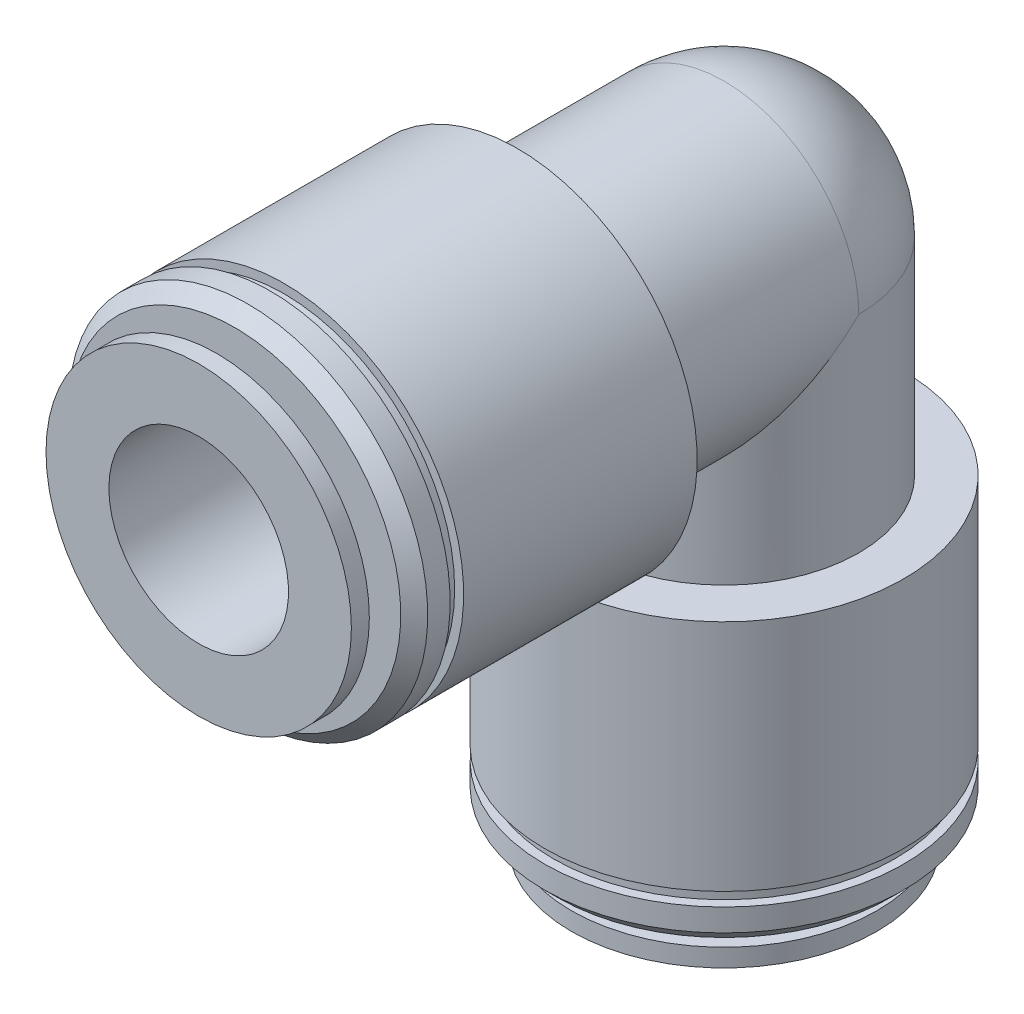
ISO-10303-21;
HEADER;
FILE_DESCRIPTION(('STEP AP214'),'2;1');
FILE_NAME('part.step','',(''),(''),'','','');
FILE_SCHEMA(('AUTOMOTIVE_DESIGN { 1 0 10303 214 1 1 1 1 }'));
ENDSEC;
DATA;
#1=APPLICATION_CONTEXT('core data for automotive mechanical design processes');
#2=APPLICATION_PROTOCOL_DEFINITION('international standard','automotive_design',2000,#1);
#3=PRODUCT_CONTEXT('',#1,'mechanical');
#4=PRODUCT('Part','Part','',(#3));
#5=PRODUCT_RELATED_PRODUCT_CATEGORY('part','',(#4));
#6=PRODUCT_DEFINITION_FORMATION('','',#4);
#7=PRODUCT_DEFINITION_CONTEXT('part definition',#1,'design');
#8=PRODUCT_DEFINITION('design','',#6,#7);
#9=PRODUCT_DEFINITION_SHAPE('','',#8);
#10=(LENGTH_UNIT() NAMED_UNIT(*) SI_UNIT(.MILLI.,.METRE.));
#11=(NAMED_UNIT(*) PLANE_ANGLE_UNIT() SI_UNIT($,.RADIAN.));
#12=(NAMED_UNIT(*) SI_UNIT($,.STERADIAN.) SOLID_ANGLE_UNIT());
#13=UNCERTAINTY_MEASURE_WITH_UNIT(LENGTH_MEASURE(1.E-05),#10,'distance_accuracy_value','');
#14=(GEOMETRIC_REPRESENTATION_CONTEXT(3) GLOBAL_UNCERTAINTY_ASSIGNED_CONTEXT((#13)) GLOBAL_UNIT_ASSIGNED_CONTEXT((#10,
#11,#12)) REPRESENTATION_CONTEXT('',''));
#15=CARTESIAN_POINT('',(0.,0.,0.));
#16=DIRECTION('',(0.,0.,1.));
#17=DIRECTION('',(1.,0.,0.));
#18=AXIS2_PLACEMENT_3D('',#15,#16,#17);
#19=CARTESIAN_POINT('',(0.,5.5,0.));
#20=DIRECTION('',(0.,1.,0.));
#21=DIRECTION('',(0.,0.,1.));
#22=AXIS2_PLACEMENT_3D('',#19,#20,#21);
#23=CYLINDRICAL_SURFACE('',#22,5.);
#24=CARTESIAN_POINT('',(0.,0.749999999999957,0.));
#25=DIRECTION('',(0.,1.,0.));
#26=DIRECTION('',(0.,0.,1.));
#27=AXIS2_PLACEMENT_3D('',#24,#25,#26);
#28=CIRCLE('',#27,5.);
#29=CARTESIAN_POINT('',(0.,0.749999999999957,5.));
#30=VERTEX_POINT('',#29);
#31=EDGE_CURVE('E116',#30,#30,#28,.T.);
#32=ORIENTED_EDGE('',*,*,#31,.F.);
#33=EDGE_LOOP('',(#32));
#34=FACE_BOUND('',#33,.T.);
#35=DIRECTION('',(0.,1.,0.));
#36=VECTOR('',#35,1.);
#37=CARTESIAN_POINT('',(3.57071421427142,5.5,3.5));
#38=LINE('',#37,#36);
#39=CARTESIAN_POINT('',(3.57071421427142,30.5,3.5));
#40=VERTEX_POINT('',#39);
#41=CARTESIAN_POINT('',(3.57071421427142,26.4999999999999,3.5));
#42=VERTEX_POINT('',#41);
#43=EDGE_CURVE('E74',#40,#42,#38,.F.);
#44=ORIENTED_EDGE('',*,*,#43,.F.);
#45=CARTESIAN_POINT('',(0.,30.5,0.));
#46=DIRECTION('',(0.,-1.,0.));
#47=DIRECTION('',(0.,0.,-1.));
#48=AXIS2_PLACEMENT_3D('',#45,#46,#47);
#49=CIRCLE('',#48,5.);
#50=CARTESIAN_POINT('',(-3.57071421427142,30.5,3.5));
#51=VERTEX_POINT('',#50);
#52=EDGE_CURVE('E78',#51,#40,#49,.T.);
#53=ORIENTED_EDGE('',*,*,#52,.F.);
#54=DIRECTION('',(0.,1.,0.));
#55=VECTOR('',#54,1.);
#56=CARTESIAN_POINT('',(-3.57071421427142,5.5,3.5));
#57=LINE('',#56,#55);
#58=CARTESIAN_POINT('',(-3.57071421427142,26.4999999999999,3.5));
#59=VERTEX_POINT('',#58);
#60=EDGE_CURVE('E49',#59,#51,#57,.T.);
#61=ORIENTED_EDGE('',*,*,#60,.F.);
#62=CARTESIAN_POINT('',(0.,30.,0.));
#63=DIRECTION('',(0.,0.707106781186548,0.707106781186547));
#64=DIRECTION('',(0.,0.707106781186548,-0.707106781186547));
#65=AXIS2_PLACEMENT_3D('',#62,#63,#64);
#66=ELLIPSE('',#65,7.07106781186551,5.00000000000002);
#67=EDGE_CURVE('E11',#59,#42,#66,.T.);
#68=ORIENTED_EDGE('',*,*,#67,.T.);
#69=EDGE_LOOP('',(#44,#53,#61,#68));
#70=FACE_BOUND('',#69,.T.);
#71=ADVANCED_FACE('F34',(#34,#70),#23,.F.);
#72=CARTESIAN_POINT('',(0.,30.5,0.));
#73=DIRECTION('',(0.,-1.,0.));
#74=DIRECTION('',(0.,0.,-1.));
#75=AXIS2_PLACEMENT_3D('',#72,#73,#74);
#76=PLANE('',#75);
#77=ORIENTED_EDGE('',*,*,#52,.T.);
#78=DIRECTION('',(-1.,0.,0.));
#79=VECTOR('',#78,1.);
#80=CARTESIAN_POINT('',(0.,30.5,3.5));
#81=LINE('',#80,#79);
#82=EDGE_CURVE('E42',#40,#51,#81,.T.);
#83=ORIENTED_EDGE('',*,*,#82,.T.);
#84=EDGE_LOOP('',(#77,#83));
#85=FACE_BOUND('',#84,.T.);
#86=ADVANCED_FACE('F167',(#85),#76,.T.);
#87=CARTESIAN_POINT('',(0.,30.,24.5));
#88=DIRECTION('',(0.,0.,1.));
#89=DIRECTION('',(1.,0.,0.));
#90=AXIS2_PLACEMENT_3D('',#87,#88,#89);
#91=PLANE('',#90);
#92=CARTESIAN_POINT('',(0.,30.,24.5));
#93=DIRECTION('',(0.,0.,1.));
#94=DIRECTION('',(1.,0.,0.));
#95=AXIS2_PLACEMENT_3D('',#92,#93,#94);
#96=CIRCLE('',#95,10.);
#97=CARTESIAN_POINT('',(-10.,30.,24.5));
#98=VERTEX_POINT('',#97);
#99=EDGE_CURVE('E153',#98,#98,#96,.T.);
#100=ORIENTED_EDGE('',*,*,#99,.T.);
#101=EDGE_LOOP('',(#100));
#102=FACE_BOUND('',#101,.T.);
#103=CARTESIAN_POINT('',(0.,30.,24.4999999999999));
#104=DIRECTION('',(0.,0.,-1.));
#105=DIRECTION('',(-1.,0.,0.));
#106=AXIS2_PLACEMENT_3D('',#103,#104,#105);
#107=CIRCLE('',#106,9.50000000000002);
#108=CARTESIAN_POINT('',(-9.50000000000002,30.,24.4999999999999));
#109=VERTEX_POINT('',#108);
#110=EDGE_CURVE('E89',#109,#109,#107,.T.);
#111=ORIENTED_EDGE('',*,*,#110,.T.);
#112=EDGE_LOOP('',(#111));
#113=FACE_BOUND('',#112,.T.);
#114=ADVANCED_FACE('F169',(#102,#113),#91,.T.);
#115=CARTESIAN_POINT('',(0.,5.5,0.));
#116=DIRECTION('',(0.,-1.,0.));
#117=DIRECTION('',(0.,0.,-1.));
#118=AXIS2_PLACEMENT_3D('',#115,#116,#117);
#119=PLANE('',#118);
#120=CARTESIAN_POINT('',(0.,5.5,0.));
#121=DIRECTION('',(0.,-1.,0.));
#122=DIRECTION('',(0.,0.,-1.));
#123=AXIS2_PLACEMENT_3D('',#120,#121,#122);
#124=CIRCLE('',#123,10.);
#125=CARTESIAN_POINT('',(0.,5.5,10.));
#126=VERTEX_POINT('',#125);
#127=EDGE_CURVE('E144',#126,#126,#124,.T.);
#128=ORIENTED_EDGE('',*,*,#127,.T.);
#129=EDGE_LOOP('',(#128));
#130=FACE_BOUND('',#129,.T.);
#131=CARTESIAN_POINT('',(0.,5.5,0.));
#132=DIRECTION('',(0.,1.,0.));
#133=DIRECTION('',(0.,0.,1.));
#134=AXIS2_PLACEMENT_3D('',#131,#132,#133);
#135=CIRCLE('',#134,9.5);
#136=CARTESIAN_POINT('',(0.,5.5,9.5));
#137=VERTEX_POINT('',#136);
#138=EDGE_CURVE('E119',#137,#137,#135,.T.);
#139=ORIENTED_EDGE('',*,*,#138,.T.);
#140=EDGE_LOOP('',(#139));
#141=FACE_BOUND('',#140,.T.);
#142=ADVANCED_FACE('F175',(#130,#141),#119,.T.);
#143=CARTESIAN_POINT('',(0.,22.5,0.));
#144=DIRECTION('',(0.,-1.,0.));
#145=DIRECTION('',(0.,0.,-1.));
#146=AXIS2_PLACEMENT_3D('',#143,#144,#145);
#147=CYLINDRICAL_SURFACE('',#146,7.5);
#148=CARTESIAN_POINT('',(0.,30.,0.));
#149=DIRECTION('',(0.,-1.,0.));
#150=DIRECTION('',(0.,0.,-1.));
#151=AXIS2_PLACEMENT_3D('',#148,#149,#150);
#152=CIRCLE('',#151,7.5);
#153=CARTESIAN_POINT('',(-7.5,30.,0.));
#154=VERTEX_POINT('',#153);
#155=CARTESIAN_POINT('',(7.5,30.,0.));
#156=VERTEX_POINT('',#155);
#157=EDGE_CURVE('E164',#154,#156,#152,.T.);
#158=ORIENTED_EDGE('',*,*,#157,.T.);
#159=CARTESIAN_POINT('',(0.,30.,0.));
#160=DIRECTION('',(0.,-0.707106781186547,-0.707106781186547));
#161=DIRECTION('',(0.,-0.707106781186547,0.707106781186547));
#162=AXIS2_PLACEMENT_3D('',#159,#160,#161);
#163=ELLIPSE('',#162,10.6066017177982,7.5);
#164=EDGE_CURVE('E56',#156,#154,#163,.T.);
#165=ORIENTED_EDGE('',*,*,#164,.T.);
#166=EDGE_LOOP('',(#158,#165));
#167=FACE_BOUND('',#166,.T.);
#168=CARTESIAN_POINT('',(0.,18.5,0.));
#169=DIRECTION('',(0.,-1.,0.));
#170=DIRECTION('',(0.,0.,-1.));
#171=AXIS2_PLACEMENT_3D('',#168,#169,#170);
#172=CIRCLE('',#171,7.5);
#173=CARTESIAN_POINT('',(0.,18.5,-7.5));
#174=VERTEX_POINT('',#173);
#175=EDGE_CURVE('E147',#174,#174,#172,.T.);
#176=ORIENTED_EDGE('',*,*,#175,.F.);
#177=EDGE_LOOP('',(#176));
#178=FACE_BOUND('',#177,.T.);
#179=ADVANCED_FACE('F36',(#167,#178),#147,.T.);
#180=CARTESIAN_POINT('',(0.,30.,0.));
#181=DIRECTION('',(0.,-1.,0.));
#182=DIRECTION('',(1.,0.,0.));
#183=AXIS2_PLACEMENT_3D('',#180,#181,#182);
#184=SPHERICAL_SURFACE('',#183,7.5);
#185=ORIENTED_EDGE('',*,*,#157,.F.);
#186=CARTESIAN_POINT('',(0.,30.,0.));
#187=DIRECTION('',(0.,0.,1.));
#188=DIRECTION('',(1.,0.,0.));
#189=AXIS2_PLACEMENT_3D('',#186,#187,#188);
#190=CIRCLE('',#189,7.5);
#191=EDGE_CURVE('E156',#156,#154,#190,.T.);
#192=ORIENTED_EDGE('',*,*,#191,.F.);
#193=EDGE_LOOP('',(#185,#192));
#194=FACE_BOUND('',#193,.T.);
#195=ADVANCED_FACE('F278',(#194),#184,.T.);
#196=CARTESIAN_POINT('',(0.,30.,11.5));
#197=DIRECTION('',(0.,0.,-1.));
#198=DIRECTION('',(-1.,0.,0.));
#199=AXIS2_PLACEMENT_3D('',#196,#197,#198);
#200=CYLINDRICAL_SURFACE('',#199,7.5);
#201=ORIENTED_EDGE('',*,*,#164,.F.);
#202=ORIENTED_EDGE('',*,*,#191,.T.);
#203=EDGE_LOOP('',(#201,#202));
#204=FACE_BOUND('',#203,.T.);
#205=CARTESIAN_POINT('',(0.,30.,11.5));
#206=DIRECTION('',(0.,0.,1.));
#207=DIRECTION('',(1.,0.,0.));
#208=AXIS2_PLACEMENT_3D('',#205,#206,#207);
#209=CIRCLE('',#208,7.5);
#210=CARTESIAN_POINT('',(7.5,30.,11.5));
#211=VERTEX_POINT('',#210);
#212=EDGE_CURVE('E159',#211,#211,#209,.T.);
#213=ORIENTED_EDGE('',*,*,#212,.F.);
#214=EDGE_LOOP('',(#213));
#215=FACE_BOUND('',#214,.T.);
#216=ADVANCED_FACE('F275',(#204,#215),#200,.T.);
#217=CARTESIAN_POINT('',(0.,30.,24.5));
#218=DIRECTION('',(0.,0.,-1.));
#219=DIRECTION('',(-1.,0.,0.));
#220=AXIS2_PLACEMENT_3D('',#217,#218,#219);
#221=CYLINDRICAL_SURFACE('',#220,10.);
#222=CARTESIAN_POINT('',(0.,30.,11.5));
#223=DIRECTION('',(0.,0.,1.));
#224=DIRECTION('',(1.,0.,0.));
#225=AXIS2_PLACEMENT_3D('',#222,#223,#224);
#226=CIRCLE('',#225,10.);
#227=CARTESIAN_POINT('',(-10.,30.,11.5));
#228=VERTEX_POINT('',#227);
#229=EDGE_CURVE('E152',#228,#228,#226,.T.);
#230=CARTESIAN_POINT('',(-10.,30.,24.5));
#231=CARTESIAN_POINT('',(-10.,30.,24.3645833333333));
#232=CARTESIAN_POINT('',(-10.,30.,24.2291666666667));
#233=CARTESIAN_POINT('',(-10.,30.,23.9583333333333));
#234=CARTESIAN_POINT('',(-10.,30.,23.8229166666667));
#235=CARTESIAN_POINT('',(-10.,30.,23.5520833333333));
#236=CARTESIAN_POINT('',(-10.,30.,23.4166666666667));
#237=CARTESIAN_POINT('',(-10.,30.,23.1458333333333));
#238=CARTESIAN_POINT('',(-10.,30.,23.0104166666667));
#239=CARTESIAN_POINT('',(-10.,30.,22.7395833333333));
#240=CARTESIAN_POINT('',(-10.,30.,22.6041666666667));
#241=CARTESIAN_POINT('',(-10.,30.,22.3333333333333));
#242=CARTESIAN_POINT('',(-10.,30.,22.1979166666667));
#243=CARTESIAN_POINT('',(-10.,30.,21.9270833333333));
#244=CARTESIAN_POINT('',(-10.,30.,21.7916666666667));
#245=CARTESIAN_POINT('',(-10.,30.,21.5208333333333));
#246=CARTESIAN_POINT('',(-10.,30.,21.3854166666667));
#247=CARTESIAN_POINT('',(-10.,30.,21.1145833333333));
#248=CARTESIAN_POINT('',(-10.,30.,20.9791666666667));
#249=CARTESIAN_POINT('',(-10.,30.,20.7083333333333));
#250=CARTESIAN_POINT('',(-10.,30.,20.5729166666667));
#251=CARTESIAN_POINT('',(-10.,30.,20.3020833333333));
#252=CARTESIAN_POINT('',(-10.,30.,20.1666666666667));
#253=CARTESIAN_POINT('',(-10.,30.,19.8958333333333));
#254=CARTESIAN_POINT('',(-10.,30.,19.7604166666667));
#255=CARTESIAN_POINT('',(-10.,30.,19.4895833333333));
#256=CARTESIAN_POINT('',(-10.,30.,19.3541666666667));
#257=CARTESIAN_POINT('',(-10.,30.,19.0833333333333));
#258=CARTESIAN_POINT('',(-10.,30.,18.9479166666667));
#259=CARTESIAN_POINT('',(-10.,30.,18.6770833333333));
#260=CARTESIAN_POINT('',(-10.,30.,18.5416666666667));
#261=CARTESIAN_POINT('',(-10.,30.,18.2708333333333));
#262=CARTESIAN_POINT('',(-10.,30.,18.1354166666667));
#263=CARTESIAN_POINT('',(-10.,30.,17.8645833333333));
#264=CARTESIAN_POINT('',(-10.,30.,17.7291666666667));
#265=CARTESIAN_POINT('',(-10.,30.,17.4583333333333));
#266=CARTESIAN_POINT('',(-10.,30.,17.3229166666667));
#267=CARTESIAN_POINT('',(-10.,30.,17.0520833333333));
#268=CARTESIAN_POINT('',(-10.,30.,16.9166666666667));
#269=CARTESIAN_POINT('',(-10.,30.,16.6458333333333));
#270=CARTESIAN_POINT('',(-10.,30.,16.5104166666667));
#271=CARTESIAN_POINT('',(-10.,30.,16.2395833333333));
#272=CARTESIAN_POINT('',(-10.,30.,16.1041666666667));
#273=CARTESIAN_POINT('',(-10.,30.,15.8333333333333));
#274=CARTESIAN_POINT('',(-10.,30.,15.6979166666667));
#275=CARTESIAN_POINT('',(-10.,30.,15.4270833333333));
#276=CARTESIAN_POINT('',(-10.,30.,15.2916666666667));
#277=CARTESIAN_POINT('',(-10.,30.,15.0208333333333));
#278=CARTESIAN_POINT('',(-10.,30.,14.8854166666667));
#279=CARTESIAN_POINT('',(-10.,30.,14.6145833333333));
#280=CARTESIAN_POINT('',(-10.,30.,14.4791666666667));
#281=CARTESIAN_POINT('',(-10.,30.,14.2083333333333));
#282=CARTESIAN_POINT('',(-10.,30.,14.0729166666667));
#283=CARTESIAN_POINT('',(-10.,30.,13.8020833333333));
#284=CARTESIAN_POINT('',(-10.,30.,13.6666666666667));
#285=CARTESIAN_POINT('',(-10.,30.,13.3958333333333));
#286=CARTESIAN_POINT('',(-10.,30.,13.2604166666667));
#287=CARTESIAN_POINT('',(-10.,30.,12.9895833333333));
#288=CARTESIAN_POINT('',(-10.,30.,12.8541666666667));
#289=CARTESIAN_POINT('',(-10.,30.,12.5833333333333));
#290=CARTESIAN_POINT('',(-10.,30.,12.4479166666667));
#291=CARTESIAN_POINT('',(-10.,30.,12.1770833333333));
#292=CARTESIAN_POINT('',(-10.,30.,12.0416666666667));
#293=CARTESIAN_POINT('',(-10.,30.,11.7708333333333));
#294=CARTESIAN_POINT('',(-10.,30.,11.6354166666667));
#295=CARTESIAN_POINT('',(-10.,30.,11.5));
#296=B_SPLINE_CURVE_WITH_KNOTS('',3,(#230,#231,#232,#233,#234,#235,#236,#237,#238,#239,#240,
#241,#242,#243,#244,#245,#246,#247,#248,#249,#250,#251,#252,#253,#254,#255,#256,#257,#258,#259,
#260,#261,#262,#263,#264,#265,#266,#267,#268,#269,#270,#271,#272,#273,#274,#275,#276,#277,#278,
#279,#280,#281,#282,#283,#284,#285,#286,#287,#288,#289,#290,#291,#292,#293,#294,#295),
.UNSPECIFIED.,.F.,.F.,(4,2,2,2,2,2,2,2,2,2,2,2,2,2,2,2,2,2,2,2,2,2,2,2,2,2,2,2,2,2,2,2,4),(0.,
0.406249999999997,0.812499999999997,1.21875,1.625,2.03125,2.4375,2.84375,3.25,3.65625,4.0625,
4.46875,4.875,5.28125,5.6875,6.09375,6.5,6.90625,7.3125,7.71875,8.125,8.53125,8.9375,9.34375,
9.75,10.15625,10.5625,10.96875,11.375,11.78125,12.1875,12.59375,13.),.UNSPECIFIED.);
#297=EDGE_CURVE('BSEAM271',#98,#228,#296,.T.);
#298=ORIENTED_EDGE('',*,*,#99,.F.);
#299=ORIENTED_EDGE('',*,*,#229,.T.);
#300=ORIENTED_EDGE('',*,*,#297,.T.);
#301=ORIENTED_EDGE('',*,*,#297,.F.);
#302=EDGE_LOOP('',(#298,#300,#299,#301));
#303=FACE_BOUND('',#302,.T.);
#304=ADVANCED_FACE('F271',(#303),#221,.T.);
#305=CARTESIAN_POINT('',(0.,30.,11.5));
#306=DIRECTION('',(0.,0.,1.));
#307=DIRECTION('',(1.,0.,0.));
#308=AXIS2_PLACEMENT_3D('',#305,#306,#307);
#309=PLANE('',#308);
#310=ORIENTED_EDGE('',*,*,#212,.T.);
#311=EDGE_LOOP('',(#310));
#312=FACE_BOUND('',#311,.T.);
#313=ORIENTED_EDGE('',*,*,#229,.F.);
#314=EDGE_LOOP('',(#313));
#315=FACE_BOUND('',#314,.T.);
#316=ADVANCED_FACE('F266',(#312,#315),#309,.F.);
#317=CARTESIAN_POINT('',(0.,5.5,0.));
#318=DIRECTION('',(0.,1.,0.));
#319=DIRECTION('',(0.,0.,1.));
#320=AXIS2_PLACEMENT_3D('',#317,#318,#319);
#321=CYLINDRICAL_SURFACE('',#320,10.);
#322=CARTESIAN_POINT('',(0.,18.5,0.));
#323=DIRECTION('',(0.,-1.,0.));
#324=DIRECTION('',(0.,0.,-1.));
#325=AXIS2_PLACEMENT_3D('',#322,#323,#324);
#326=CIRCLE('',#325,10.);
#327=CARTESIAN_POINT('',(0.,18.5,10.));
#328=VERTEX_POINT('',#327);
#329=EDGE_CURVE('E143',#328,#328,#326,.T.);
#330=CARTESIAN_POINT('',(0.,5.5,10.));
#331=CARTESIAN_POINT('',(0.,5.63541666666667,10.));
#332=CARTESIAN_POINT('',(0.,5.77083333333333,10.));
#333=CARTESIAN_POINT('',(0.,6.04166666666667,10.));
#334=CARTESIAN_POINT('',(0.,6.17708333333333,10.));
#335=CARTESIAN_POINT('',(0.,6.44791666666667,10.));
#336=CARTESIAN_POINT('',(0.,6.58333333333333,10.));
#337=CARTESIAN_POINT('',(0.,6.85416666666667,10.));
#338=CARTESIAN_POINT('',(0.,6.98958333333333,10.));
#339=CARTESIAN_POINT('',(0.,7.26041666666667,10.));
#340=CARTESIAN_POINT('',(0.,7.39583333333333,10.));
#341=CARTESIAN_POINT('',(0.,7.66666666666667,10.));
#342=CARTESIAN_POINT('',(0.,7.80208333333333,10.));
#343=CARTESIAN_POINT('',(0.,8.07291666666667,10.));
#344=CARTESIAN_POINT('',(0.,8.20833333333333,10.));
#345=CARTESIAN_POINT('',(0.,8.47916666666667,10.));
#346=CARTESIAN_POINT('',(0.,8.61458333333333,10.));
#347=CARTESIAN_POINT('',(0.,8.88541666666667,10.));
#348=CARTESIAN_POINT('',(0.,9.02083333333333,10.));
#349=CARTESIAN_POINT('',(0.,9.29166666666667,10.));
#350=CARTESIAN_POINT('',(0.,9.42708333333333,10.));
#351=CARTESIAN_POINT('',(0.,9.69791666666667,10.));
#352=CARTESIAN_POINT('',(0.,9.83333333333333,10.));
#353=CARTESIAN_POINT('',(0.,10.1041666666667,10.));
#354=CARTESIAN_POINT('',(0.,10.2395833333333,10.));
#355=CARTESIAN_POINT('',(0.,10.5104166666667,10.));
#356=CARTESIAN_POINT('',(0.,10.6458333333333,10.));
#357=CARTESIAN_POINT('',(0.,10.9166666666667,10.));
#358=CARTESIAN_POINT('',(0.,11.0520833333333,10.));
#359=CARTESIAN_POINT('',(0.,11.3229166666667,10.));
#360=CARTESIAN_POINT('',(0.,11.4583333333333,10.));
#361=CARTESIAN_POINT('',(0.,11.7291666666667,10.));
#362=CARTESIAN_POINT('',(0.,11.8645833333333,10.));
#363=CARTESIAN_POINT('',(0.,12.1354166666667,10.));
#364=CARTESIAN_POINT('',(0.,12.2708333333333,10.));
#365=CARTESIAN_POINT('',(0.,12.5416666666667,10.));
#366=CARTESIAN_POINT('',(0.,12.6770833333333,10.));
#367=CARTESIAN_POINT('',(0.,12.9479166666667,10.));
#368=CARTESIAN_POINT('',(0.,13.0833333333333,10.));
#369=CARTESIAN_POINT('',(0.,13.3541666666667,10.));
#370=CARTESIAN_POINT('',(0.,13.4895833333333,10.));
#371=CARTESIAN_POINT('',(0.,13.7604166666667,10.));
#372=CARTESIAN_POINT('',(0.,13.8958333333333,10.));
#373=CARTESIAN_POINT('',(0.,14.1666666666667,10.));
#374=CARTESIAN_POINT('',(0.,14.3020833333333,10.));
#375=CARTESIAN_POINT('',(0.,14.5729166666667,10.));
#376=CARTESIAN_POINT('',(0.,14.7083333333333,10.));
#377=CARTESIAN_POINT('',(0.,14.9791666666667,10.));
#378=CARTESIAN_POINT('',(0.,15.1145833333333,10.));
#379=CARTESIAN_POINT('',(0.,15.3854166666667,10.));
#380=CARTESIAN_POINT('',(0.,15.5208333333333,10.));
#381=CARTESIAN_POINT('',(0.,15.7916666666667,10.));
#382=CARTESIAN_POINT('',(0.,15.9270833333333,10.));
#383=CARTESIAN_POINT('',(0.,16.1979166666667,10.));
#384=CARTESIAN_POINT('',(0.,16.3333333333333,10.));
#385=CARTESIAN_POINT('',(0.,16.6041666666667,10.));
#386=CARTESIAN_POINT('',(0.,16.7395833333333,10.));
#387=CARTESIAN_POINT('',(0.,17.0104166666667,10.));
#388=CARTESIAN_POINT('',(0.,17.1458333333333,10.));
#389=CARTESIAN_POINT('',(0.,17.4166666666667,10.));
#390=CARTESIAN_POINT('',(0.,17.5520833333333,10.));
#391=CARTESIAN_POINT('',(0.,17.8229166666667,10.));
#392=CARTESIAN_POINT('',(0.,17.9583333333333,10.));
#393=CARTESIAN_POINT('',(0.,18.2291666666667,10.));
#394=CARTESIAN_POINT('',(0.,18.3645833333333,10.));
#395=CARTESIAN_POINT('',(0.,18.5,10.));
#396=B_SPLINE_CURVE_WITH_KNOTS('',3,(#330,#331,#332,#333,#334,#335,#336,#337,#338,#339,#340,
#341,#342,#343,#344,#345,#346,#347,#348,#349,#350,#351,#352,#353,#354,#355,#356,#357,#358,#359,
#360,#361,#362,#363,#364,#365,#366,#367,#368,#369,#370,#371,#372,#373,#374,#375,#376,#377,#378,
#379,#380,#381,#382,#383,#384,#385,#386,#387,#388,#389,#390,#391,#392,#393,#394,#395),
.UNSPECIFIED.,.F.,.F.,(4,2,2,2,2,2,2,2,2,2,2,2,2,2,2,2,2,2,2,2,2,2,2,2,2,2,2,2,2,2,2,2,4),(0.,
0.40625,0.8125,1.21875,1.625,2.03125,2.4375,2.84375,3.25,3.65625,4.0625,4.46875,4.875,5.28125,
5.6875,6.09375,6.5,6.90625,7.3125,7.71875,8.125,8.53125,8.9375,9.34375,9.75,10.15625,10.5625,
10.96875,11.375,11.78125,12.1875,12.59375,13.),.UNSPECIFIED.);
#397=EDGE_CURVE('BSEAM263',#126,#328,#396,.T.);
#398=ORIENTED_EDGE('',*,*,#127,.F.);
#399=ORIENTED_EDGE('',*,*,#329,.T.);
#400=ORIENTED_EDGE('',*,*,#397,.T.);
#401=ORIENTED_EDGE('',*,*,#397,.F.);
#402=EDGE_LOOP('',(#398,#400,#399,#401));
#403=FACE_BOUND('',#402,.T.);
#404=ADVANCED_FACE('F263',(#403),#321,.T.);
#405=CARTESIAN_POINT('',(0.,18.5,0.));
#406=DIRECTION('',(0.,-1.,0.));
#407=DIRECTION('',(0.,0.,-1.));
#408=AXIS2_PLACEMENT_3D('',#405,#406,#407);
#409=PLANE('',#408);
#410=ORIENTED_EDGE('',*,*,#175,.T.);
#411=EDGE_LOOP('',(#410));
#412=FACE_BOUND('',#411,.T.);
#413=ORIENTED_EDGE('',*,*,#329,.F.);
#414=EDGE_LOOP('',(#413));
#415=FACE_BOUND('',#414,.T.);
#416=ADVANCED_FACE('F256',(#412,#415),#409,.F.);
#417=CARTESIAN_POINT('',(0.,5.5,0.));
#418=DIRECTION('',(0.,1.,0.));
#419=DIRECTION('',(0.,0.,1.));
#420=AXIS2_PLACEMENT_3D('',#417,#418,#419);
#421=CYLINDRICAL_SURFACE('',#420,8.50000000000006);
#422=CARTESIAN_POINT('',(0.,1.75000000000006,0.));
#423=DIRECTION('',(0.,1.,0.));
#424=DIRECTION('',(0.,0.,1.));
#425=AXIS2_PLACEMENT_3D('',#422,#423,#424);
#426=CIRCLE('',#425,8.50000000000006);
#427=CARTESIAN_POINT('',(0.,1.75000000000006,8.50000000000006));
#428=VERTEX_POINT('',#427);
#429=EDGE_CURVE('E140',#428,#428,#426,.T.);
#430=ORIENTED_EDGE('',*,*,#429,.F.);
#431=EDGE_LOOP('',(#430));
#432=FACE_BOUND('',#431,.T.);
#433=CARTESIAN_POINT('',(0.,0.749999999999962,0.));
#434=DIRECTION('',(0.,1.,0.));
#435=DIRECTION('',(0.,0.,1.));
#436=AXIS2_PLACEMENT_3D('',#433,#434,#435);
#437=CIRCLE('',#436,8.50000000000006);
#438=CARTESIAN_POINT('',(0.,0.749999999999962,8.50000000000006));
#439=VERTEX_POINT('',#438);
#440=EDGE_CURVE('E113',#439,#439,#437,.T.);
#441=ORIENTED_EDGE('',*,*,#440,.T.);
#442=EDGE_LOOP('',(#441));
#443=FACE_BOUND('',#442,.T.);
#444=ADVANCED_FACE('F252',(#432,#443),#421,.T.);
#445=CARTESIAN_POINT('',(0.,1.75000000000005,-8.50000000000006));
#446=DIRECTION('',(0.,-1.,0.));
#447=DIRECTION('',(0.,0.,-1.));
#448=AXIS2_PLACEMENT_3D('',#445,#446,#447);
#449=PLANE('',#448);
#450=CARTESIAN_POINT('',(0.,1.75000000000005,0.));
#451=DIRECTION('',(0.,1.,0.));
#452=DIRECTION('',(0.,0.,1.));
#453=AXIS2_PLACEMENT_3D('',#450,#451,#452);
#454=CIRCLE('',#453,6.50000000000004);
#455=CARTESIAN_POINT('',(0.,1.75000000000005,6.50000000000004));
#456=VERTEX_POINT('',#455);
#457=EDGE_CURVE('E137',#456,#456,#454,.T.);
#458=ORIENTED_EDGE('',*,*,#457,.F.);
#459=EDGE_LOOP('',(#458));
#460=FACE_BOUND('',#459,.T.);
#461=ORIENTED_EDGE('',*,*,#429,.T.);
#462=EDGE_LOOP('',(#461));
#463=FACE_BOUND('',#462,.T.);
#464=ADVANCED_FACE('F248',(#460,#463),#449,.F.);
#465=CARTESIAN_POINT('',(0.,5.5,0.));
#466=DIRECTION('',(0.,1.,0.));
#467=DIRECTION('',(0.,0.,1.));
#468=AXIS2_PLACEMENT_3D('',#465,#466,#467);
#469=CYLINDRICAL_SURFACE('',#468,6.50000000000004);
#470=CARTESIAN_POINT('',(0.,2.75,0.));
#471=DIRECTION('',(0.,1.,0.));
#472=DIRECTION('',(0.,0.,1.));
#473=AXIS2_PLACEMENT_3D('',#470,#471,#472);
#474=CIRCLE('',#473,6.50000000000004);
#475=CARTESIAN_POINT('',(0.,2.75,6.50000000000004));
#476=VERTEX_POINT('',#475);
#477=EDGE_CURVE('E134',#476,#476,#474,.T.);
#478=ORIENTED_EDGE('',*,*,#477,.F.);
#479=EDGE_LOOP('',(#478));
#480=FACE_BOUND('',#479,.T.);
#481=ORIENTED_EDGE('',*,*,#457,.T.);
#482=EDGE_LOOP('',(#481));
#483=FACE_BOUND('',#482,.T.);
#484=ADVANCED_FACE('F244',(#480,#483),#469,.T.);
#485=CARTESIAN_POINT('',(0.,2.75,-6.50000000000004));
#486=DIRECTION('',(0.,1.,0.));
#487=DIRECTION('',(0.,0.,1.));
#488=AXIS2_PLACEMENT_3D('',#485,#486,#487);
#489=PLANE('',#488);
#490=CARTESIAN_POINT('',(0.,2.75,0.));
#491=DIRECTION('',(0.,1.,0.));
#492=DIRECTION('',(0.,0.,1.));
#493=AXIS2_PLACEMENT_3D('',#490,#491,#492);
#494=CIRCLE('',#493,9.25000000000002);
#495=CARTESIAN_POINT('',(0.,2.75,9.25000000000002));
#496=VERTEX_POINT('',#495);
#497=EDGE_CURVE('E131',#496,#496,#494,.T.);
#498=ORIENTED_EDGE('',*,*,#497,.F.);
#499=EDGE_LOOP('',(#498));
#500=FACE_BOUND('',#499,.T.);
#501=ORIENTED_EDGE('',*,*,#477,.T.);
#502=EDGE_LOOP('',(#501));
#503=FACE_BOUND('',#502,.T.);
#504=ADVANCED_FACE('F240',(#500,#503),#489,.F.);
#505=CARTESIAN_POINT('',(0.,2.75,0.));
#506=DIRECTION('',(0.,1.,0.));
#507=DIRECTION('',(0.,0.,1.));
#508=AXIS2_PLACEMENT_3D('',#505,#506,#507);
#509=CONICAL_SURFACE('',#508,9.25000000000002,0.78539816339745);
#510=CARTESIAN_POINT('',(0.,3.5,0.));
#511=DIRECTION('',(0.,1.,0.));
#512=DIRECTION('',(0.,0.,1.));
#513=AXIS2_PLACEMENT_3D('',#510,#511,#512);
#514=CIRCLE('',#513,10.);
#515=CARTESIAN_POINT('',(0.,3.5,10.));
#516=VERTEX_POINT('',#515);
#517=EDGE_CURVE('E128',#516,#516,#514,.T.);
#518=ORIENTED_EDGE('',*,*,#517,.F.);
#519=EDGE_LOOP('',(#518));
#520=FACE_BOUND('',#519,.T.);
#521=ORIENTED_EDGE('',*,*,#497,.T.);
#522=EDGE_LOOP('',(#521));
#523=FACE_BOUND('',#522,.T.);
#524=ADVANCED_FACE('F236',(#520,#523),#509,.T.);
#525=CARTESIAN_POINT('',(0.,5.5,0.));
#526=DIRECTION('',(0.,1.,0.));
#527=DIRECTION('',(0.,0.,1.));
#528=AXIS2_PLACEMENT_3D('',#525,#526,#527);
#529=CYLINDRICAL_SURFACE('',#528,10.);
#530=CARTESIAN_POINT('',(0.,4.75000000000002,0.));
#531=DIRECTION('',(0.,1.,0.));
#532=DIRECTION('',(0.,0.,1.));
#533=AXIS2_PLACEMENT_3D('',#530,#531,#532);
#534=CIRCLE('',#533,10.);
#535=CARTESIAN_POINT('',(0.,4.75000000000002,10.));
#536=VERTEX_POINT('',#535);
#537=EDGE_CURVE('E125',#536,#536,#534,.T.);
#538=ORIENTED_EDGE('',*,*,#537,.F.);
#539=EDGE_LOOP('',(#538));
#540=FACE_BOUND('',#539,.T.);
#541=ORIENTED_EDGE('',*,*,#517,.T.);
#542=EDGE_LOOP('',(#541));
#543=FACE_BOUND('',#542,.T.);
#544=ADVANCED_FACE('F232',(#540,#543),#529,.T.);
#545=CARTESIAN_POINT('',(0.,4.75000000000002,-10.));
#546=DIRECTION('',(0.,-1.,0.));
#547=DIRECTION('',(0.,0.,-1.));
#548=AXIS2_PLACEMENT_3D('',#545,#546,#547);
#549=PLANE('',#548);
#550=CARTESIAN_POINT('',(0.,4.75000000000002,0.));
#551=DIRECTION('',(0.,1.,0.));
#552=DIRECTION('',(0.,0.,1.));
#553=AXIS2_PLACEMENT_3D('',#550,#551,#552);
#554=CIRCLE('',#553,9.5);
#555=CARTESIAN_POINT('',(0.,4.75000000000002,9.5));
#556=VERTEX_POINT('',#555);
#557=EDGE_CURVE('E122',#556,#556,#554,.T.);
#558=ORIENTED_EDGE('',*,*,#557,.F.);
#559=EDGE_LOOP('',(#558));
#560=FACE_BOUND('',#559,.T.);
#561=ORIENTED_EDGE('',*,*,#537,.T.);
#562=EDGE_LOOP('',(#561));
#563=FACE_BOUND('',#562,.T.);
#564=ADVANCED_FACE('F228',(#560,#563),#549,.F.);
#565=CARTESIAN_POINT('',(0.,5.5,0.));
#566=DIRECTION('',(0.,1.,0.));
#567=DIRECTION('',(0.,0.,1.));
#568=AXIS2_PLACEMENT_3D('',#565,#566,#567);
#569=CYLINDRICAL_SURFACE('',#568,9.5);
#570=ORIENTED_EDGE('',*,*,#138,.F.);
#571=EDGE_LOOP('',(#570));
#572=FACE_BOUND('',#571,.T.);
#573=ORIENTED_EDGE('',*,*,#557,.T.);
#574=EDGE_LOOP('',(#573));
#575=FACE_BOUND('',#574,.T.);
#576=ADVANCED_FACE('F223',(#572,#575),#569,.T.);
#577=CARTESIAN_POINT('',(0.,0.74999999999996,-5.));
#578=DIRECTION('',(0.,1.,0.));
#579=DIRECTION('',(0.,0.,1.));
#580=AXIS2_PLACEMENT_3D('',#577,#578,#579);
#581=PLANE('',#580);
#582=ORIENTED_EDGE('',*,*,#440,.F.);
#583=EDGE_LOOP('',(#582));
#584=FACE_BOUND('',#583,.T.);
#585=ORIENTED_EDGE('',*,*,#31,.T.);
#586=EDGE_LOOP('',(#585));
#587=FACE_BOUND('',#586,.T.);
#588=ADVANCED_FACE('F220',(#584,#587),#581,.F.);
#589=CARTESIAN_POINT('',(0.,30.,24.5));
#590=DIRECTION('',(0.,0.,-1.));
#591=DIRECTION('',(-1.,0.,0.));
#592=AXIS2_PLACEMENT_3D('',#589,#590,#591);
#593=CYLINDRICAL_SURFACE('',#592,8.50000000000012);
#594=CARTESIAN_POINT('',(0.,30.,28.2499999999998));
#595=DIRECTION('',(0.,0.,-1.));
#596=DIRECTION('',(-1.,0.,0.));
#597=AXIS2_PLACEMENT_3D('',#594,#595,#596);
#598=CIRCLE('',#597,8.50000000000011);
#599=CARTESIAN_POINT('',(-8.50000000000011,30.,28.2499999999998));
#600=VERTEX_POINT('',#599);
#601=EDGE_CURVE('E110',#600,#600,#598,.T.);
#602=ORIENTED_EDGE('',*,*,#601,.F.);
#603=EDGE_LOOP('',(#602));
#604=FACE_BOUND('',#603,.T.);
#605=CARTESIAN_POINT('',(0.,30.,29.25));
#606=DIRECTION('',(0.,0.,-1.));
#607=DIRECTION('',(-1.,0.,0.));
#608=AXIS2_PLACEMENT_3D('',#605,#606,#607);
#609=CIRCLE('',#608,8.50000000000012);
#610=CARTESIAN_POINT('',(-8.50000000000012,30.,29.25));
#611=VERTEX_POINT('',#610);
#612=EDGE_CURVE('E83',#611,#611,#609,.T.);
#613=ORIENTED_EDGE('',*,*,#612,.T.);
#614=EDGE_LOOP('',(#613));
#615=FACE_BOUND('',#614,.T.);
#616=ADVANCED_FACE('F216',(#604,#615),#593,.T.);
#617=CARTESIAN_POINT('',(0.,21.4999999999999,28.2499999999999));
#618=DIRECTION('',(0.,0.,1.));
#619=DIRECTION('',(1.,0.,0.));
#620=AXIS2_PLACEMENT_3D('',#617,#618,#619);
#621=PLANE('',#620);
#622=CARTESIAN_POINT('',(0.,30.,28.2499999999999));
#623=DIRECTION('',(0.,0.,-1.));
#624=DIRECTION('',(-1.,0.,0.));
#625=AXIS2_PLACEMENT_3D('',#622,#623,#624);
#626=CIRCLE('',#625,6.50000000000009);
#627=CARTESIAN_POINT('',(-6.50000000000009,30.,28.2499999999999));
#628=VERTEX_POINT('',#627);
#629=EDGE_CURVE('E107',#628,#628,#626,.T.);
#630=ORIENTED_EDGE('',*,*,#629,.F.);
#631=EDGE_LOOP('',(#630));
#632=FACE_BOUND('',#631,.T.);
#633=ORIENTED_EDGE('',*,*,#601,.T.);
#634=EDGE_LOOP('',(#633));
#635=FACE_BOUND('',#634,.T.);
#636=ADVANCED_FACE('F212',(#632,#635),#621,.F.);
#637=CARTESIAN_POINT('',(0.,30.,24.5));
#638=DIRECTION('',(0.,0.,-1.));
#639=DIRECTION('',(-1.,0.,0.));
#640=AXIS2_PLACEMENT_3D('',#637,#638,#639);
#641=CYLINDRICAL_SURFACE('',#640,6.50000000000009);
#642=CARTESIAN_POINT('',(0.,30.,27.2499999999999));
#643=DIRECTION('',(0.,0.,-1.));
#644=DIRECTION('',(-1.,0.,0.));
#645=AXIS2_PLACEMENT_3D('',#642,#643,#644);
#646=CIRCLE('',#645,6.50000000000008);
#647=CARTESIAN_POINT('',(-6.50000000000008,30.,27.2499999999999));
#648=VERTEX_POINT('',#647);
#649=EDGE_CURVE('E104',#648,#648,#646,.T.);
#650=ORIENTED_EDGE('',*,*,#649,.F.);
#651=EDGE_LOOP('',(#650));
#652=FACE_BOUND('',#651,.T.);
#653=ORIENTED_EDGE('',*,*,#629,.T.);
#654=EDGE_LOOP('',(#653));
#655=FACE_BOUND('',#654,.T.);
#656=ADVANCED_FACE('F208',(#652,#655),#641,.T.);
#657=CARTESIAN_POINT('',(0.,23.4999999999999,27.2499999999999));
#658=DIRECTION('',(0.,0.,-1.));
#659=DIRECTION('',(-1.,0.,0.));
#660=AXIS2_PLACEMENT_3D('',#657,#658,#659);
#661=PLANE('',#660);
#662=CARTESIAN_POINT('',(0.,30.,27.2499999999999));
#663=DIRECTION('',(0.,0.,-1.));
#664=DIRECTION('',(-1.,0.,0.));
#665=AXIS2_PLACEMENT_3D('',#662,#663,#664);
#666=CIRCLE('',#665,9.25000000000005);
#667=CARTESIAN_POINT('',(-9.25000000000005,30.,27.2499999999999));
#668=VERTEX_POINT('',#667);
#669=EDGE_CURVE('E101',#668,#668,#666,.T.);
#670=ORIENTED_EDGE('',*,*,#669,.F.);
#671=EDGE_LOOP('',(#670));
#672=FACE_BOUND('',#671,.T.);
#673=ORIENTED_EDGE('',*,*,#649,.T.);
#674=EDGE_LOOP('',(#673));
#675=FACE_BOUND('',#674,.T.);
#676=ADVANCED_FACE('F204',(#672,#675),#661,.F.);
#677=CARTESIAN_POINT('',(0.,30.,27.2499999999999));
#678=DIRECTION('',(0.,0.,-1.));
#679=DIRECTION('',(-1.,0.,0.));
#680=AXIS2_PLACEMENT_3D('',#677,#678,#679);
#681=CONICAL_SURFACE('',#680,9.25000000000005,0.785398163397448);
#682=CARTESIAN_POINT('',(0.,30.,26.4999999999999));
#683=DIRECTION('',(0.,0.,-1.));
#684=DIRECTION('',(-1.,0.,0.));
#685=AXIS2_PLACEMENT_3D('',#682,#683,#684);
#686=CIRCLE('',#685,10.0000000000001);
#687=CARTESIAN_POINT('',(-10.0000000000001,30.,26.4999999999999));
#688=VERTEX_POINT('',#687);
#689=EDGE_CURVE('E98',#688,#688,#686,.T.);
#690=ORIENTED_EDGE('',*,*,#689,.F.);
#691=EDGE_LOOP('',(#690));
#692=FACE_BOUND('',#691,.T.);
#693=ORIENTED_EDGE('',*,*,#669,.T.);
#694=EDGE_LOOP('',(#693));
#695=FACE_BOUND('',#694,.T.);
#696=ADVANCED_FACE('F200',(#692,#695),#681,.T.);
#697=CARTESIAN_POINT('',(0.,30.,24.5));
#698=DIRECTION('',(0.,0.,-1.));
#699=DIRECTION('',(-1.,0.,0.));
#700=AXIS2_PLACEMENT_3D('',#697,#698,#699);
#701=CYLINDRICAL_SURFACE('',#700,10.0000000000001);
#702=CARTESIAN_POINT('',(0.,30.,25.2499999999999));
#703=DIRECTION('',(0.,0.,-1.));
#704=DIRECTION('',(-1.,0.,0.));
#705=AXIS2_PLACEMENT_3D('',#702,#703,#704);
#706=CIRCLE('',#705,10.0000000000001);
#707=CARTESIAN_POINT('',(-10.0000000000001,30.,25.2499999999999));
#708=VERTEX_POINT('',#707);
#709=EDGE_CURVE('E95',#708,#708,#706,.T.);
#710=ORIENTED_EDGE('',*,*,#709,.F.);
#711=EDGE_LOOP('',(#710));
#712=FACE_BOUND('',#711,.T.);
#713=ORIENTED_EDGE('',*,*,#689,.T.);
#714=EDGE_LOOP('',(#713));
#715=FACE_BOUND('',#714,.T.);
#716=ADVANCED_FACE('F196',(#712,#715),#701,.T.);
#717=CARTESIAN_POINT('',(0.,19.9999999999999,25.2499999999999));
#718=DIRECTION('',(0.,0.,1.));
#719=DIRECTION('',(1.,0.,0.));
#720=AXIS2_PLACEMENT_3D('',#717,#718,#719);
#721=PLANE('',#720);
#722=CARTESIAN_POINT('',(0.,30.,25.2499999999999));
#723=DIRECTION('',(0.,0.,-1.));
#724=DIRECTION('',(-1.,0.,0.));
#725=AXIS2_PLACEMENT_3D('',#722,#723,#724);
#726=CIRCLE('',#725,9.50000000000001);
#727=CARTESIAN_POINT('',(-9.50000000000001,30.,25.2499999999999));
#728=VERTEX_POINT('',#727);
#729=EDGE_CURVE('E92',#728,#728,#726,.T.);
#730=ORIENTED_EDGE('',*,*,#729,.F.);
#731=EDGE_LOOP('',(#730));
#732=FACE_BOUND('',#731,.T.);
#733=ORIENTED_EDGE('',*,*,#709,.T.);
#734=EDGE_LOOP('',(#733));
#735=FACE_BOUND('',#734,.T.);
#736=ADVANCED_FACE('F192',(#732,#735),#721,.F.);
#737=CARTESIAN_POINT('',(0.,30.,24.5));
#738=DIRECTION('',(0.,0.,-1.));
#739=DIRECTION('',(-1.,0.,0.));
#740=AXIS2_PLACEMENT_3D('',#737,#738,#739);
#741=CYLINDRICAL_SURFACE('',#740,9.50000000000002);
#742=ORIENTED_EDGE('',*,*,#110,.F.);
#743=EDGE_LOOP('',(#742));
#744=FACE_BOUND('',#743,.T.);
#745=ORIENTED_EDGE('',*,*,#729,.T.);
#746=EDGE_LOOP('',(#745));
#747=FACE_BOUND('',#746,.T.);
#748=ADVANCED_FACE('F188',(#744,#747),#741,.T.);
#749=CARTESIAN_POINT('',(0.,30.,24.5));
#750=DIRECTION('',(0.,0.,-1.));
#751=DIRECTION('',(-1.,0.,0.));
#752=AXIS2_PLACEMENT_3D('',#749,#750,#751);
#753=CYLINDRICAL_SURFACE('',#752,5.00000000000005);
#754=CARTESIAN_POINT('',(0.,30.,29.25));
#755=DIRECTION('',(0.,0.,-1.));
#756=DIRECTION('',(-1.,0.,0.));
#757=AXIS2_PLACEMENT_3D('',#754,#755,#756);
#758=CIRCLE('',#757,5.00000000000006);
#759=CARTESIAN_POINT('',(-5.00000000000006,30.,29.25));
#760=VERTEX_POINT('',#759);
#761=EDGE_CURVE('E86',#760,#760,#758,.T.);
#762=ORIENTED_EDGE('',*,*,#761,.F.);
#763=EDGE_LOOP('',(#762));
#764=FACE_BOUND('',#763,.T.);
#765=CARTESIAN_POINT('',(0.,30.,3.5));
#766=DIRECTION('',(0.,0.,1.));
#767=DIRECTION('',(1.,0.,0.));
#768=AXIS2_PLACEMENT_3D('',#765,#766,#767);
#769=CIRCLE('',#768,5.00000000000004);
#770=EDGE_CURVE('E70',#42,#59,#769,.T.);
#771=ORIENTED_EDGE('',*,*,#770,.F.);
#772=ORIENTED_EDGE('',*,*,#67,.F.);
#773=EDGE_LOOP('',(#771,#772));
#774=FACE_BOUND('',#773,.T.);
#775=ADVANCED_FACE('F69',(#764,#774),#753,.F.);
#776=CARTESIAN_POINT('',(0.,24.9999999999999,29.25));
#777=DIRECTION('',(0.,0.,-1.));
#778=DIRECTION('',(-1.,0.,0.));
#779=AXIS2_PLACEMENT_3D('',#776,#777,#778);
#780=PLANE('',#779);
#781=ORIENTED_EDGE('',*,*,#612,.F.);
#782=EDGE_LOOP('',(#781));
#783=FACE_BOUND('',#782,.T.);
#784=ORIENTED_EDGE('',*,*,#761,.T.);
#785=EDGE_LOOP('',(#784));
#786=FACE_BOUND('',#785,.T.);
#787=ADVANCED_FACE('F182',(#783,#786),#780,.F.);
#788=CARTESIAN_POINT('',(0.,30.,3.5));
#789=DIRECTION('',(0.,0.,1.));
#790=DIRECTION('',(1.,0.,0.));
#791=AXIS2_PLACEMENT_3D('',#788,#789,#790);
#792=PLANE('',#791);
#793=ORIENTED_EDGE('',*,*,#43,.T.);
#794=ORIENTED_EDGE('',*,*,#770,.T.);
#795=ORIENTED_EDGE('',*,*,#60,.T.);
#796=ORIENTED_EDGE('',*,*,#82,.F.);
#797=EDGE_LOOP('',(#793,#794,#795,#796));
#798=FACE_BOUND('',#797,.T.);
#799=ADVANCED_FACE('F73',(#798),#792,.T.);
#800=CLOSED_SHELL('',(#71,#86,#114,#142,#179,#195,#216,#304,#316,#404,#416,#444,#464,#484,#504,
#524,#544,#564,#576,#588,#616,#636,#656,#676,#696,#716,#736,#748,#775,#787,#799));
#801=MANIFOLD_SOLID_BREP('B2',#800);
#802=ADVANCED_BREP_SHAPE_REPRESENTATION('',(#18,#801),#14);
#803=SHAPE_DEFINITION_REPRESENTATION(#9,#802);
ENDSEC;
END-ISO-10303-21;
